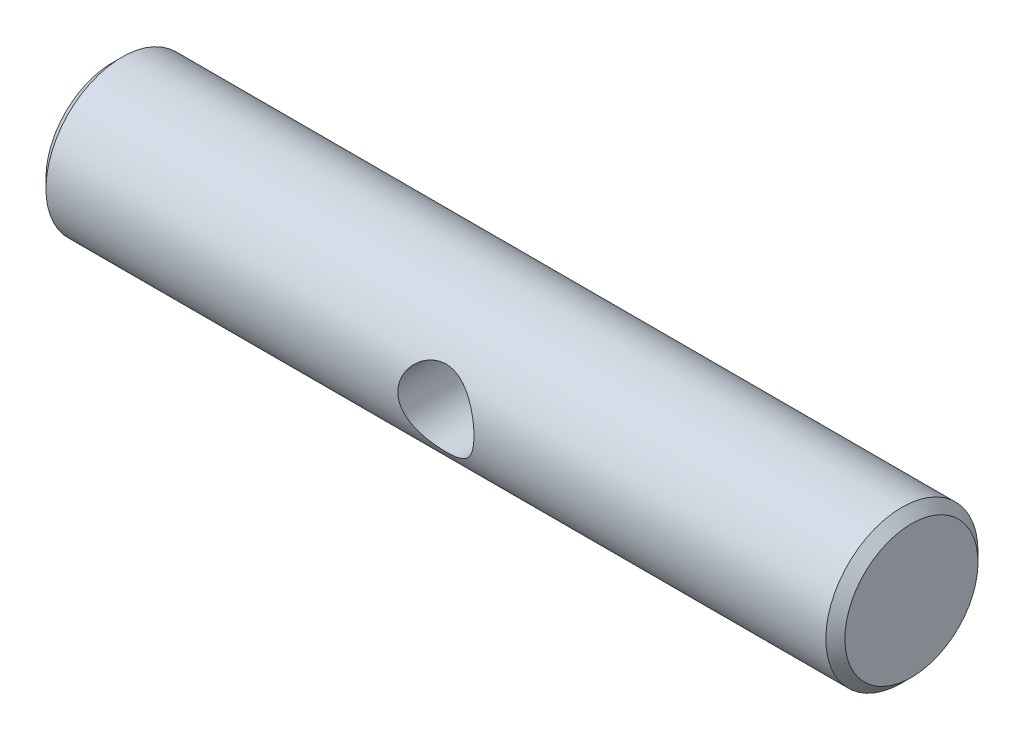
ISO-10303-21;
HEADER;
FILE_DESCRIPTION(('STEP AP214'),'2;1');
FILE_NAME('part.step','',(''),(''),'','','');
FILE_SCHEMA(('AUTOMOTIVE_DESIGN { 1 0 10303 214 1 1 1 1 }'));
ENDSEC;
DATA;
#1=APPLICATION_CONTEXT('core data for automotive mechanical design processes');
#2=APPLICATION_PROTOCOL_DEFINITION('international standard','automotive_design',2000,#1);
#3=PRODUCT_CONTEXT('',#1,'mechanical');
#4=PRODUCT('Part','Part','',(#3));
#5=PRODUCT_RELATED_PRODUCT_CATEGORY('part','',(#4));
#6=PRODUCT_DEFINITION_FORMATION('','',#4);
#7=PRODUCT_DEFINITION_CONTEXT('part definition',#1,'design');
#8=PRODUCT_DEFINITION('design','',#6,#7);
#9=PRODUCT_DEFINITION_SHAPE('','',#8);
#10=(LENGTH_UNIT() NAMED_UNIT(*) SI_UNIT(.MILLI.,.METRE.));
#11=(NAMED_UNIT(*) PLANE_ANGLE_UNIT() SI_UNIT($,.RADIAN.));
#12=(NAMED_UNIT(*) SI_UNIT($,.STERADIAN.) SOLID_ANGLE_UNIT());
#13=UNCERTAINTY_MEASURE_WITH_UNIT(LENGTH_MEASURE(1.E-05),#10,'distance_accuracy_value','');
#14=(GEOMETRIC_REPRESENTATION_CONTEXT(3) GLOBAL_UNCERTAINTY_ASSIGNED_CONTEXT((#13)) GLOBAL_UNIT_ASSIGNED_CONTEXT((#10,
#11,#12)) REPRESENTATION_CONTEXT('',''));
#15=CARTESIAN_POINT('',(0.,0.,0.));
#16=DIRECTION('',(0.,0.,1.));
#17=DIRECTION('',(1.,0.,0.));
#18=AXIS2_PLACEMENT_3D('',#15,#16,#17);
#19=CARTESIAN_POINT('',(0.,0.,0.));
#20=DIRECTION('',(-1.,0.,0.));
#21=DIRECTION('',(0.,-1.,0.));
#22=AXIS2_PLACEMENT_3D('',#19,#20,#21);
#23=PLANE('',#22);
#24=CARTESIAN_POINT('',(0.,0.,0.));
#25=DIRECTION('',(-1.,0.,0.));
#26=DIRECTION('',(0.,-1.,0.));
#27=AXIS2_PLACEMENT_3D('',#24,#25,#26);
#28=CIRCLE('',#27,1.75);
#29=CARTESIAN_POINT('',(0.,-1.75,0.));
#30=VERTEX_POINT('',#29);
#31=EDGE_CURVE('E59',#30,#30,#28,.T.);
#32=ORIENTED_EDGE('',*,*,#31,.T.);
#33=EDGE_LOOP('',(#32));
#34=FACE_BOUND('',#33,.T.);
#35=ADVANCED_FACE('F40',(#34),#23,.T.);
#36=CARTESIAN_POINT('',(-16.7017543859649,0.,0.));
#37=DIRECTION('',(-1.,0.,0.));
#38=DIRECTION('',(0.,-1.,0.));
#39=AXIS2_PLACEMENT_3D('',#36,#37,#38);
#40=CYLINDRICAL_SURFACE('',#39,2.);
#41=CARTESIAN_POINT('',(0.250000000000004,0.,0.));
#42=DIRECTION('',(-1.,0.,0.));
#43=DIRECTION('',(0.,-1.,0.));
#44=AXIS2_PLACEMENT_3D('',#41,#42,#43);
#45=CIRCLE('',#44,2.);
#46=CARTESIAN_POINT('',(0.250000000000004,-2.,0.));
#47=VERTEX_POINT('',#46);
#48=EDGE_CURVE('E49',#47,#47,#45,.F.);
#49=ORIENTED_EDGE('',*,*,#48,.T.);
#50=EDGE_LOOP('',(#49));
#51=FACE_BOUND('',#50,.T.);
#52=CARTESIAN_POINT('',(20.75,0.,0.));
#53=DIRECTION('',(1.,0.,0.));
#54=DIRECTION('',(0.,1.,0.));
#55=AXIS2_PLACEMENT_3D('',#52,#53,#54);
#56=CIRCLE('',#55,2.);
#57=CARTESIAN_POINT('',(20.75,2.,0.));
#58=VERTEX_POINT('',#57);
#59=EDGE_CURVE('E54',#58,#58,#56,.F.);
#60=ORIENTED_EDGE('',*,*,#59,.T.);
#61=EDGE_LOOP('',(#60));
#62=FACE_BOUND('',#61,.T.);
#63=CARTESIAN_POINT('',(11.5,0.,-2.));
#64=CARTESIAN_POINT('',(11.4999966976805,-0.0525719629529866,-1.99999713404151));
#65=CARTESIAN_POINT('',(11.4958299268783,-0.105206599698033,-1.99790491019518));
#66=CARTESIAN_POINT('',(11.4793471196591,-0.208920235268425,-1.98974156037396));
#67=CARTESIAN_POINT('',(11.4670156070024,-0.259996086713504,-1.98366287828984));
#68=CARTESIAN_POINT('',(11.4348061913832,-0.358933544880574,-1.96816279403312));
#69=CARTESIAN_POINT('',(11.414957615752,-0.40680680293918,-1.9587543917752));
#70=CARTESIAN_POINT('',(11.3684293786351,-0.498472616806565,-1.93745776515779));
#71=CARTESIAN_POINT('',(11.3417502557511,-0.54226549399005,-1.9255697363353));
#72=CARTESIAN_POINT('',(11.2804827505147,-0.62750781776192,-1.89956258258057));
#73=CARTESIAN_POINT('',(11.2455135207604,-0.668655211122113,-1.88535199127536));
#74=CARTESIAN_POINT('',(11.169478520753,-0.744779444866978,-1.85659970246744));
#75=CARTESIAN_POINT('',(11.1284081482276,-0.779751583106767,-1.84205776209035));
#76=CARTESIAN_POINT('',(11.0375166504766,-0.845252000450279,-1.81298951197347));
#77=CARTESIAN_POINT('',(10.9872639016541,-0.875225335551638,-1.79855186970132));
#78=CARTESIAN_POINT('',(10.8816326640138,-0.926168226890696,-1.77285978772321));
#79=CARTESIAN_POINT('',(10.8262578712773,-0.947144214966335,-1.7616030760699));
#80=CARTESIAN_POINT('',(10.7153348945781,-0.97813244218859,-1.74457867037808));
#81=CARTESIAN_POINT('',(10.6599955479326,-0.988725857080443,-1.73852271583714));
#82=CARTESIAN_POINT('',(10.5480211622205,-1.00042699330885,-1.73181889948528));
#83=CARTESIAN_POINT('',(10.4913874591288,-1.00154408837308,-1.73116569343288));
#84=CARTESIAN_POINT('',(10.3857139756846,-0.994687287172296,-1.73510930257248));
#85=CARTESIAN_POINT('',(10.3365759687769,-0.987784559536823,-1.73908763662014));
#86=CARTESIAN_POINT('',(10.240278090627,-0.966939849056934,-1.7507622873385));
#87=CARTESIAN_POINT('',(10.1931188546947,-0.952995623897653,-1.75845978831776));
#88=CARTESIAN_POINT('',(10.1007708674343,-0.918209780386005,-1.77687476412741));
#89=CARTESIAN_POINT('',(10.0556536012142,-0.897215067115996,-1.78765840663998));
#90=CARTESIAN_POINT('',(9.96936570740999,-0.849041687668004,-1.81103404281404));
#91=CARTESIAN_POINT('',(9.92819686439991,-0.821860243812469,-1.82362684780191));
#92=CARTESIAN_POINT('',(9.84547874725677,-0.75806605491279,-1.85113157903286));
#93=CARTESIAN_POINT('',(9.80454312642384,-0.720694458369283,-1.86613510236746));
#94=CARTESIAN_POINT('',(9.7292645814091,-0.639555578741375,-1.89547623300407));
#95=CARTESIAN_POINT('',(9.69492480796611,-0.595785256574287,-1.90981351958801));
#96=CARTESIAN_POINT('',(9.63231433897027,-0.50051650583185,-1.93701987282964));
#97=CARTESIAN_POINT('',(9.60439952755426,-0.44875359159941,-1.94978984162007));
#98=CARTESIAN_POINT('',(9.55790297095699,-0.340466215488798,-1.97157881121242));
#99=CARTESIAN_POINT('',(9.53931381498483,-0.283945576265278,-1.98060078943553));
#100=CARTESIAN_POINT('',(9.51352459628332,-0.172766491660703,-1.99324333741436));
#101=CARTESIAN_POINT('',(9.50550876425322,-0.118341530548326,-1.99724938301312));
#102=CARTESIAN_POINT('',(9.49853526886551,-0.008779599949355,-2.00073013459102));
#103=CARTESIAN_POINT('',(9.49957331436052,0.0463570198699002,-2.00020698721312));
#104=CARTESIAN_POINT('',(9.51020668841875,0.151232971985993,-1.99491192253441));
#105=CARTESIAN_POINT('',(9.51913253273003,0.201059408049953,-1.9904724568819));
#106=CARTESIAN_POINT('',(9.54423807189508,0.298406892301916,-1.97822171314819));
#107=CARTESIAN_POINT('',(9.56041856645336,0.345927685690996,-1.97041006334333));
#108=CARTESIAN_POINT('',(9.59999846643317,0.438888608449665,-1.9518425141367));
#109=CARTESIAN_POINT('',(9.62359105011681,0.484230397006154,-1.94100881769939));
#110=CARTESIAN_POINT('',(9.67710753564604,0.570461361698921,-1.91743974317109));
#111=CARTESIAN_POINT('',(9.70703413459343,0.611348629775282,-1.90470355565785));
#112=CARTESIAN_POINT('',(9.77576042533287,0.691767689290654,-1.87708221337464));
#113=CARTESIAN_POINT('',(9.81514286845356,0.730772077824639,-1.86210884848441));
#114=CARTESIAN_POINT('',(9.8999251512693,0.80185632111324,-1.83262391603874));
#115=CARTESIAN_POINT('',(9.94532911881637,0.833931385690841,-1.81811267381526));
#116=CARTESIAN_POINT('',(10.0436436542003,0.891707914497696,-1.79051192226068));
#117=CARTESIAN_POINT('',(10.0968112662086,0.917025495878638,-1.77752529663472));
#118=CARTESIAN_POINT('',(10.2075100676925,0.958082826013804,-1.75574072368126));
#119=CARTESIAN_POINT('',(10.2650355265012,0.973834915887571,-1.74693738240618));
#120=CARTESIAN_POINT('',(10.3769102228614,0.993861687449681,-1.73561501008667));
#121=CARTESIAN_POINT('',(10.431034253429,0.999092996400866,-1.73257383460491));
#122=CARTESIAN_POINT('',(10.5394470671707,1.00068915438079,-1.73165354646175));
#123=CARTESIAN_POINT('',(10.5937357687394,0.9970578466244,-1.73377219627553));
#124=CARTESIAN_POINT('',(10.695483501532,0.981926125592265,-1.74237862050025));
#125=CARTESIAN_POINT('',(10.7431004701444,0.971208314342801,-1.74843094482394));
#126=CARTESIAN_POINT('',(10.8358081194247,0.943175358224647,-1.76371016187917));
#127=CARTESIAN_POINT('',(10.880897982092,0.925858091159813,-1.77293807569675));
#128=CARTESIAN_POINT('',(10.9706248509866,0.883815745300685,-1.79428530364528));
#129=CARTESIAN_POINT('',(11.0150279018297,0.85867113781646,-1.80655722396191));
#130=CARTESIAN_POINT('',(11.0992745361806,0.802150971636636,-1.8323533163459));
#131=CARTESIAN_POINT('',(11.1391157305185,0.77077217123865,-1.84587813794522));
#132=CARTESIAN_POINT('',(11.2181419823576,0.698203326664643,-1.87462323159313));
#133=CARTESIAN_POINT('',(11.2566591023619,0.656284423010173,-1.88984983311469));
#134=CARTESIAN_POINT('',(11.3262629834236,0.566154806220281,-1.91877752255088));
#135=CARTESIAN_POINT('',(11.3573457394263,0.517940723256786,-1.9324777860804));
#136=CARTESIAN_POINT('',(11.4112363627622,0.415931596819948,-1.95698009585103));
#137=CARTESIAN_POINT('',(11.4339841694114,0.362099503934616,-1.96776096562909));
#138=CARTESIAN_POINT('',(11.469808167919,0.250742101294193,-1.98501341363465));
#139=CARTESIAN_POINT('',(11.4829118468296,0.193227799623168,-1.99149723372932));
#140=CARTESIAN_POINT('',(11.4938974110758,0.112601946483385,-1.99695461909663));
#141=CARTESIAN_POINT('',(11.4961826408636,0.0901618794395,-1.99809365339202));
#142=CARTESIAN_POINT('',(11.4992346655168,0.0451517318071585,-1.99961696977865));
#143=CARTESIAN_POINT('',(11.5000014184712,0.0225816476473818,-2.00000123103763));
#144=CARTESIAN_POINT('',(11.5,0.,-2.));
#145=B_SPLINE_CURVE_WITH_KNOTS('',3,(#63,#64,#65,#66,#67,#68,#69,#70,#71,#72,#73,#74,#75,#76,
#77,#78,#79,#80,#81,#82,#83,#84,#85,#86,#87,#88,#89,#90,#91,#92,#93,#94,#95,#96,#97,#98,#99,
#100,#101,#102,#103,#104,#105,#106,#107,#108,#109,#110,#111,#112,#113,#114,#115,#116,#117,#118,
#119,#120,#121,#122,#123,#124,#125,#126,#127,#128,#129,#130,#131,#132,#133,#134,#135,#136,#137,
#138,#139,#140,#141,#142,#143,#144),.UNSPECIFIED.,.T.,.F.,(4,2,2,2,2,2,2,2,2,2,2,2,2,2,2,2,2,2,
2,2,2,2,2,2,2,2,2,2,2,2,2,2,2,2,2,2,2,2,2,2,4),(0.,0.157624257420293,0.315548149709198,
0.472862155492298,0.630163760581568,0.79698175871809,0.963926237654036,1.14381726430753,
1.32357947898281,1.4925801214023,1.66141357329021,1.81005712409321,1.95874803925679,
2.11090240168488,2.26312521260222,2.43464941333879,2.60625534598687,2.78583022214441,
2.9652621691228,3.12983290471346,3.29432564511476,3.44606906506122,3.59782921630932,
3.75392856027899,3.9100945074834,4.08159610644419,4.25321588615432,4.43314682159675,
4.61284511940778,4.77529307498374,4.93767059860006,5.08457930244183,5.23153528783679,
5.38836456775615,5.54527561138959,5.72125242752499,5.89732383376574,6.07464013662926,
6.25144908624931,6.31915280137699,6.38685838514848),.UNSPECIFIED.);
#146=CARTESIAN_POINT('',(11.5,0.,-2.));
#147=VERTEX_POINT('',#146);
#148=EDGE_CURVE('E65',#147,#147,#145,.T.);
#149=ORIENTED_EDGE('',*,*,#148,.F.);
#150=EDGE_LOOP('',(#149));
#151=FACE_BOUND('',#150,.T.);
#152=CARTESIAN_POINT('',(11.5,0.,2.));
#153=CARTESIAN_POINT('',(11.4999966976805,0.0525719629529866,1.99999713404151));
#154=CARTESIAN_POINT('',(11.4958299268783,0.105206599698033,1.99790491019518));
#155=CARTESIAN_POINT('',(11.4793471196591,0.208920235268425,1.98974156037396));
#156=CARTESIAN_POINT('',(11.4670156070024,0.259996086713504,1.98366287828984));
#157=CARTESIAN_POINT('',(11.4348061913832,0.358933544880574,1.96816279403312));
#158=CARTESIAN_POINT('',(11.414957615752,0.40680680293918,1.9587543917752));
#159=CARTESIAN_POINT('',(11.3684293786351,0.498472616806565,1.93745776515779));
#160=CARTESIAN_POINT('',(11.3417502557511,0.54226549399005,1.9255697363353));
#161=CARTESIAN_POINT('',(11.2804827505147,0.62750781776192,1.89956258258057));
#162=CARTESIAN_POINT('',(11.2455135207604,0.668655211122113,1.88535199127536));
#163=CARTESIAN_POINT('',(11.169478520753,0.744779444866978,1.85659970246744));
#164=CARTESIAN_POINT('',(11.1284081482276,0.779751583106767,1.84205776209035));
#165=CARTESIAN_POINT('',(11.0375166504766,0.845252000450279,1.81298951197347));
#166=CARTESIAN_POINT('',(10.9872639016541,0.875225335551638,1.79855186970132));
#167=CARTESIAN_POINT('',(10.8816326640138,0.926168226890696,1.77285978772321));
#168=CARTESIAN_POINT('',(10.8262578712773,0.947144214966335,1.7616030760699));
#169=CARTESIAN_POINT('',(10.7153348945781,0.97813244218859,1.74457867037808));
#170=CARTESIAN_POINT('',(10.6599955479326,0.988725857080443,1.73852271583714));
#171=CARTESIAN_POINT('',(10.5480211622205,1.00042699330885,1.73181889948528));
#172=CARTESIAN_POINT('',(10.4913874591288,1.00154408837308,1.73116569343288));
#173=CARTESIAN_POINT('',(10.3857139756846,0.994687287172296,1.73510930257248));
#174=CARTESIAN_POINT('',(10.3365759687769,0.987784559536823,1.73908763662014));
#175=CARTESIAN_POINT('',(10.240278090627,0.966939849056934,1.7507622873385));
#176=CARTESIAN_POINT('',(10.1931188546947,0.952995623897653,1.75845978831776));
#177=CARTESIAN_POINT('',(10.1007708674343,0.918209780386005,1.77687476412741));
#178=CARTESIAN_POINT('',(10.0556536012142,0.897215067115996,1.78765840663998));
#179=CARTESIAN_POINT('',(9.96936570740999,0.849041687668004,1.81103404281404));
#180=CARTESIAN_POINT('',(9.92819686439991,0.821860243812469,1.82362684780191));
#181=CARTESIAN_POINT('',(9.84547874725677,0.75806605491279,1.85113157903286));
#182=CARTESIAN_POINT('',(9.80454312642384,0.720694458369283,1.86613510236746));
#183=CARTESIAN_POINT('',(9.7292645814091,0.639555578741375,1.89547623300407));
#184=CARTESIAN_POINT('',(9.69492480796611,0.595785256574287,1.90981351958801));
#185=CARTESIAN_POINT('',(9.63231433897027,0.50051650583185,1.93701987282964));
#186=CARTESIAN_POINT('',(9.60439952755426,0.44875359159941,1.94978984162007));
#187=CARTESIAN_POINT('',(9.55790297095699,0.340466215488798,1.97157881121242));
#188=CARTESIAN_POINT('',(9.53931381498483,0.283945576265278,1.98060078943553));
#189=CARTESIAN_POINT('',(9.51352459628332,0.172766491660703,1.99324333741436));
#190=CARTESIAN_POINT('',(9.50550876425322,0.118341530548326,1.99724938301312));
#191=CARTESIAN_POINT('',(9.49853526886551,0.008779599949355,2.00073013459102));
#192=CARTESIAN_POINT('',(9.49957331436052,-0.0463570198699002,2.00020698721312));
#193=CARTESIAN_POINT('',(9.51020668841875,-0.151232971985993,1.99491192253441));
#194=CARTESIAN_POINT('',(9.51913253273003,-0.201059408049953,1.9904724568819));
#195=CARTESIAN_POINT('',(9.54423807189508,-0.298406892301916,1.97822171314819));
#196=CARTESIAN_POINT('',(9.56041856645336,-0.345927685690996,1.97041006334333));
#197=CARTESIAN_POINT('',(9.59999846643317,-0.438888608449665,1.9518425141367));
#198=CARTESIAN_POINT('',(9.62359105011681,-0.484230397006154,1.94100881769939));
#199=CARTESIAN_POINT('',(9.67710753564604,-0.570461361698921,1.91743974317109));
#200=CARTESIAN_POINT('',(9.70703413459343,-0.611348629775282,1.90470355565785));
#201=CARTESIAN_POINT('',(9.77576042533287,-0.691767689290654,1.87708221337464));
#202=CARTESIAN_POINT('',(9.81514286845356,-0.730772077824639,1.86210884848441));
#203=CARTESIAN_POINT('',(9.8999251512693,-0.80185632111324,1.83262391603874));
#204=CARTESIAN_POINT('',(9.94532911881637,-0.833931385690841,1.81811267381526));
#205=CARTESIAN_POINT('',(10.0436436542003,-0.891707914497696,1.79051192226068));
#206=CARTESIAN_POINT('',(10.0968112662086,-0.917025495878638,1.77752529663472));
#207=CARTESIAN_POINT('',(10.2075100676925,-0.958082826013804,1.75574072368126));
#208=CARTESIAN_POINT('',(10.2650355265012,-0.973834915887571,1.74693738240618));
#209=CARTESIAN_POINT('',(10.3769102228614,-0.993861687449681,1.73561501008667));
#210=CARTESIAN_POINT('',(10.431034253429,-0.999092996400866,1.73257383460491));
#211=CARTESIAN_POINT('',(10.5394470671707,-1.00068915438079,1.73165354646175));
#212=CARTESIAN_POINT('',(10.5937357687394,-0.9970578466244,1.73377219627553));
#213=CARTESIAN_POINT('',(10.695483501532,-0.981926125592265,1.74237862050025));
#214=CARTESIAN_POINT('',(10.7431004701444,-0.971208314342801,1.74843094482394));
#215=CARTESIAN_POINT('',(10.8358081194247,-0.943175358224647,1.76371016187917));
#216=CARTESIAN_POINT('',(10.880897982092,-0.925858091159813,1.77293807569675));
#217=CARTESIAN_POINT('',(10.9706248509866,-0.883815745300685,1.79428530364528));
#218=CARTESIAN_POINT('',(11.0150279018297,-0.85867113781646,1.80655722396191));
#219=CARTESIAN_POINT('',(11.0992745361806,-0.802150971636636,1.8323533163459));
#220=CARTESIAN_POINT('',(11.1391157305185,-0.77077217123865,1.84587813794522));
#221=CARTESIAN_POINT('',(11.2181419823576,-0.698203326664643,1.87462323159313));
#222=CARTESIAN_POINT('',(11.2566591023619,-0.656284423010173,1.88984983311469));
#223=CARTESIAN_POINT('',(11.3262629834236,-0.566154806220281,1.91877752255088));
#224=CARTESIAN_POINT('',(11.3573457394263,-0.517940723256786,1.9324777860804));
#225=CARTESIAN_POINT('',(11.4112363627622,-0.415931596819948,1.95698009585103));
#226=CARTESIAN_POINT('',(11.4339841694114,-0.362099503934616,1.96776096562909));
#227=CARTESIAN_POINT('',(11.469808167919,-0.250742101294193,1.98501341363465));
#228=CARTESIAN_POINT('',(11.4829118468296,-0.193227799623168,1.99149723372932));
#229=CARTESIAN_POINT('',(11.4938974110758,-0.112601946483385,1.99695461909663));
#230=CARTESIAN_POINT('',(11.4961826408636,-0.0901618794395,1.99809365339202));
#231=CARTESIAN_POINT('',(11.4992346655168,-0.0451517318071585,1.99961696977865));
#232=CARTESIAN_POINT('',(11.5000014184712,-0.0225816476473818,2.00000123103763));
#233=CARTESIAN_POINT('',(11.5,0.,2.));
#234=B_SPLINE_CURVE_WITH_KNOTS('',3,(#152,#153,#154,#155,#156,#157,#158,#159,#160,#161,#162,
#163,#164,#165,#166,#167,#168,#169,#170,#171,#172,#173,#174,#175,#176,#177,#178,#179,#180,#181,
#182,#183,#184,#185,#186,#187,#188,#189,#190,#191,#192,#193,#194,#195,#196,#197,#198,#199,#200,
#201,#202,#203,#204,#205,#206,#207,#208,#209,#210,#211,#212,#213,#214,#215,#216,#217,#218,#219,
#220,#221,#222,#223,#224,#225,#226,#227,#228,#229,#230,#231,#232,#233),.UNSPECIFIED.,.T.,.F.,(4,
2,2,2,2,2,2,2,2,2,2,2,2,2,2,2,2,2,2,2,2,2,2,2,2,2,2,2,2,2,2,2,2,2,2,2,2,2,2,2,4),(0.,
0.157624257420293,0.315548149709198,0.472862155492298,0.630163760581568,0.79698175871809,
0.963926237654036,1.14381726430753,1.32357947898281,1.4925801214023,1.66141357329021,
1.81005712409321,1.95874803925679,2.11090240168488,2.26312521260222,2.43464941333879,
2.60625534598687,2.78583022214441,2.9652621691228,3.12983290471346,3.29432564511476,
3.44606906506122,3.59782921630932,3.75392856027899,3.9100945074834,4.08159610644419,
4.25321588615432,4.43314682159675,4.61284511940778,4.77529307498374,4.93767059860006,
5.08457930244183,5.23153528783679,5.38836456775615,5.54527561138959,5.72125242752499,
5.89732383376574,6.07464013662926,6.25144908624931,6.31915280137699,6.38685838514848),.UNSPECIFIED.);
#235=CARTESIAN_POINT('',(11.5,0.,2.));
#236=VERTEX_POINT('',#235);
#237=EDGE_CURVE('E74',#236,#236,#234,.T.);
#238=ORIENTED_EDGE('',*,*,#237,.F.);
#239=EDGE_LOOP('',(#238));
#240=FACE_BOUND('',#239,.T.);
#241=ADVANCED_FACE('F78',(#51,#62,#151,#240),#40,.T.);
#242=CARTESIAN_POINT('',(21.,0.,0.));
#243=DIRECTION('',(1.,0.,0.));
#244=DIRECTION('',(0.,1.,0.));
#245=AXIS2_PLACEMENT_3D('',#242,#243,#244);
#246=PLANE('',#245);
#247=CARTESIAN_POINT('',(21.,0.,0.));
#248=DIRECTION('',(1.,0.,0.));
#249=DIRECTION('',(0.,1.,0.));
#250=AXIS2_PLACEMENT_3D('',#247,#248,#249);
#251=CIRCLE('',#250,1.75);
#252=CARTESIAN_POINT('',(21.,1.75,0.));
#253=VERTEX_POINT('',#252);
#254=EDGE_CURVE('E10',#253,#253,#251,.T.);
#255=ORIENTED_EDGE('',*,*,#254,.T.);
#256=EDGE_LOOP('',(#255));
#257=FACE_BOUND('',#256,.T.);
#258=ADVANCED_FACE('F86',(#257),#246,.T.);
#259=CARTESIAN_POINT('',(10.5,0.,-5.));
#260=DIRECTION('',(0.,0.,1.));
#261=DIRECTION('',(1.,0.,0.));
#262=AXIS2_PLACEMENT_3D('',#259,#260,#261);
#263=CYLINDRICAL_SURFACE('',#262,1.);
#264=ORIENTED_EDGE('',*,*,#148,.T.);
#265=EDGE_LOOP('',(#264));
#266=FACE_BOUND('',#265,.T.);
#267=ORIENTED_EDGE('',*,*,#237,.T.);
#268=EDGE_LOOP('',(#267));
#269=FACE_BOUND('',#268,.T.);
#270=ADVANCED_FACE('F82',(#266,#269),#263,.F.);
#271=CARTESIAN_POINT('',(0.,0.,0.));
#272=DIRECTION('',(1.,0.,0.));
#273=DIRECTION('',(0.,1.,0.));
#274=AXIS2_PLACEMENT_3D('',#271,#272,#273);
#275=CONICAL_SURFACE('',#274,1.75,0.785398163397446);
#276=ORIENTED_EDGE('',*,*,#48,.F.);
#277=EDGE_LOOP('',(#276));
#278=FACE_BOUND('',#277,.T.);
#279=ORIENTED_EDGE('',*,*,#31,.F.);
#280=EDGE_LOOP('',(#279));
#281=FACE_BOUND('',#280,.T.);
#282=ADVANCED_FACE('F85',(#278,#281),#275,.T.);
#283=CARTESIAN_POINT('',(20.75,0.,0.));
#284=DIRECTION('',(-1.,0.,0.));
#285=DIRECTION('',(0.,-1.,0.));
#286=AXIS2_PLACEMENT_3D('',#283,#284,#285);
#287=CONICAL_SURFACE('',#286,2.,0.785398163397456);
#288=ORIENTED_EDGE('',*,*,#254,.F.);
#289=EDGE_LOOP('',(#288));
#290=FACE_BOUND('',#289,.T.);
#291=ORIENTED_EDGE('',*,*,#59,.F.);
#292=EDGE_LOOP('',(#291));
#293=FACE_BOUND('',#292,.T.);
#294=ADVANCED_FACE('F43',(#290,#293),#287,.T.);
#295=CLOSED_SHELL('',(#35,#241,#258,#270,#282,#294));
#296=MANIFOLD_SOLID_BREP('B2',#295);
#297=ADVANCED_BREP_SHAPE_REPRESENTATION('',(#18,#296),#14);
#298=SHAPE_DEFINITION_REPRESENTATION(#9,#297);
ENDSEC;
END-ISO-10303-21;
